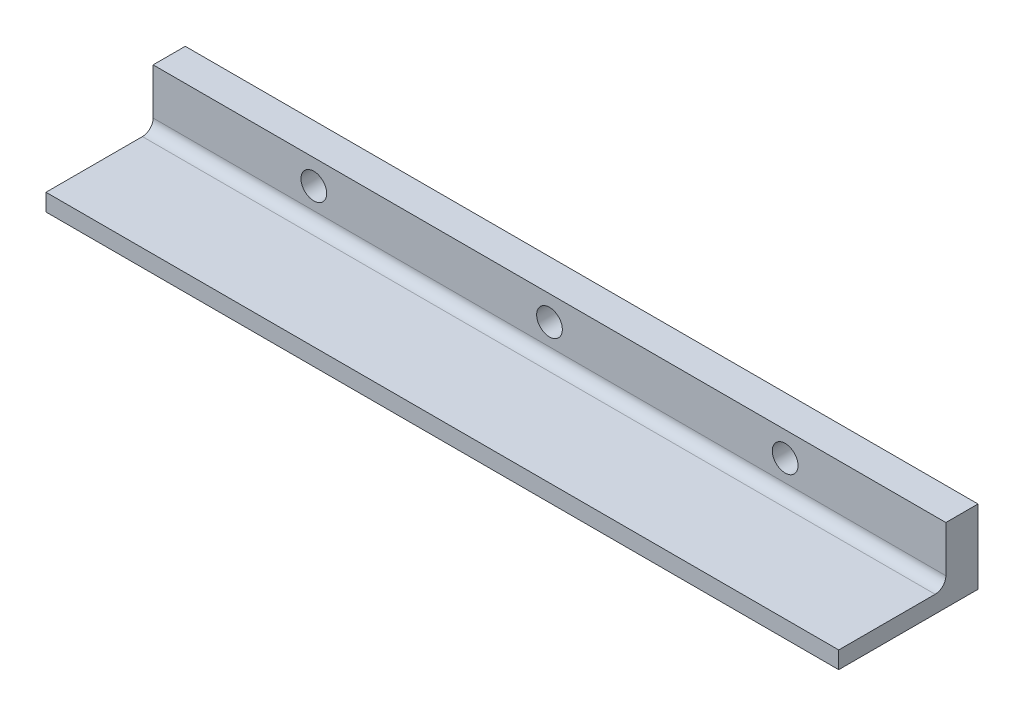
ISO-10303-21;
HEADER;
FILE_DESCRIPTION(('STEP AP214'),'2;1');
FILE_NAME('part.step','',(''),(''),'','','');
FILE_SCHEMA(('AUTOMOTIVE_DESIGN { 1 0 10303 214 1 1 1 1 }'));
ENDSEC;
DATA;
#1=APPLICATION_CONTEXT('core data for automotive mechanical design processes');
#2=APPLICATION_PROTOCOL_DEFINITION('international standard','automotive_design',2000,#1);
#3=PRODUCT_CONTEXT('',#1,'mechanical');
#4=PRODUCT('Part','Part','',(#3));
#5=PRODUCT_RELATED_PRODUCT_CATEGORY('part','',(#4));
#6=PRODUCT_DEFINITION_FORMATION('','',#4);
#7=PRODUCT_DEFINITION_CONTEXT('part definition',#1,'design');
#8=PRODUCT_DEFINITION('design','',#6,#7);
#9=PRODUCT_DEFINITION_SHAPE('','',#8);
#10=(LENGTH_UNIT() NAMED_UNIT(*) SI_UNIT(.MILLI.,.METRE.));
#11=(NAMED_UNIT(*) PLANE_ANGLE_UNIT() SI_UNIT($,.RADIAN.));
#12=(NAMED_UNIT(*) SI_UNIT($,.STERADIAN.) SOLID_ANGLE_UNIT());
#13=UNCERTAINTY_MEASURE_WITH_UNIT(LENGTH_MEASURE(1.E-05),#10,'distance_accuracy_value','');
#14=(GEOMETRIC_REPRESENTATION_CONTEXT(3) GLOBAL_UNCERTAINTY_ASSIGNED_CONTEXT((#13)) GLOBAL_UNIT_ASSIGNED_CONTEXT((#10,
#11,#12)) REPRESENTATION_CONTEXT('',''));
#15=CARTESIAN_POINT('',(0.,0.,0.));
#16=DIRECTION('',(0.,0.,1.));
#17=DIRECTION('',(1.,0.,0.));
#18=AXIS2_PLACEMENT_3D('',#15,#16,#17);
#19=CARTESIAN_POINT('',(0.,1.6,0.));
#20=DIRECTION('',(0.,-1.,0.));
#21=DIRECTION('',(0.,0.,-1.));
#22=AXIS2_PLACEMENT_3D('',#19,#20,#21);
#23=PLANE('',#22);
#24=DIRECTION('',(0.,0.,-1.));
#25=VECTOR('',#24,1.);
#26=CARTESIAN_POINT('',(37.,1.6,6.5));
#27=LINE('',#26,#25);
#28=CARTESIAN_POINT('',(37.,1.6,6.5));
#29=VERTEX_POINT('',#28);
#30=CARTESIAN_POINT('',(37.,1.6,-2.5));
#31=VERTEX_POINT('',#30);
#32=EDGE_CURVE('E129',#29,#31,#27,.T.);
#33=ORIENTED_EDGE('',*,*,#32,.T.);
#34=DIRECTION('',(1.,0.,0.));
#35=VECTOR('',#34,1.);
#36=CARTESIAN_POINT('',(-37.,1.6,-2.5));
#37=LINE('',#36,#35);
#38=CARTESIAN_POINT('',(-37.,1.6,-2.5));
#39=VERTEX_POINT('',#38);
#40=EDGE_CURVE('E59',#31,#39,#37,.F.);
#41=ORIENTED_EDGE('',*,*,#40,.T.);
#42=DIRECTION('',(0.,0.,1.));
#43=VECTOR('',#42,1.);
#44=CARTESIAN_POINT('',(-37.,1.6,6.5));
#45=LINE('',#44,#43);
#46=CARTESIAN_POINT('',(-37.,1.6,6.5));
#47=VERTEX_POINT('',#46);
#48=EDGE_CURVE('E131',#39,#47,#45,.T.);
#49=ORIENTED_EDGE('',*,*,#48,.T.);
#50=DIRECTION('',(1.,0.,0.));
#51=VECTOR('',#50,1.);
#52=CARTESIAN_POINT('',(-37.,1.6,6.5));
#53=LINE('',#52,#51);
#54=EDGE_CURVE('E134',#47,#29,#53,.T.);
#55=ORIENTED_EDGE('',*,*,#54,.T.);
#56=EDGE_LOOP('',(#33,#41,#49,#55));
#57=FACE_BOUND('',#56,.T.);
#58=ADVANCED_FACE('F37',(#57),#23,.F.);
#59=CARTESIAN_POINT('',(37.,1.6,6.5));
#60=DIRECTION('',(-1.,0.,0.));
#61=DIRECTION('',(0.,0.,1.));
#62=AXIS2_PLACEMENT_3D('',#59,#60,#61);
#63=PLANE('',#62);
#64=DIRECTION('',(0.,0.,-1.));
#65=VECTOR('',#64,1.);
#66=CARTESIAN_POINT('',(37.,0.,6.5));
#67=LINE('',#66,#65);
#68=CARTESIAN_POINT('',(37.,0.,6.5));
#69=VERTEX_POINT('',#68);
#70=CARTESIAN_POINT('',(37.,0.,-6.5));
#71=VERTEX_POINT('',#70);
#72=EDGE_CURVE('E121',#69,#71,#67,.T.);
#73=ORIENTED_EDGE('',*,*,#72,.T.);
#74=DIRECTION('',(0.,-1.,0.));
#75=VECTOR('',#74,1.);
#76=CARTESIAN_POINT('',(37.,1.6,-6.5));
#77=LINE('',#76,#75);
#78=CARTESIAN_POINT('',(37.,6.9,-6.5));
#79=VERTEX_POINT('',#78);
#80=EDGE_CURVE('E148',#79,#71,#77,.T.);
#81=ORIENTED_EDGE('',*,*,#80,.F.);
#82=DIRECTION('',(0.,0.,-1.));
#83=VECTOR('',#82,1.);
#84=CARTESIAN_POINT('',(37.,6.9,-6.5));
#85=LINE('',#84,#83);
#86=CARTESIAN_POINT('',(37.,6.9,-3.5));
#87=VERTEX_POINT('',#86);
#88=EDGE_CURVE('E107',#87,#79,#85,.T.);
#89=ORIENTED_EDGE('',*,*,#88,.F.);
#90=DIRECTION('',(0.,-1.,0.));
#91=VECTOR('',#90,1.);
#92=CARTESIAN_POINT('',(37.,6.9,-3.5));
#93=LINE('',#92,#91);
#94=CARTESIAN_POINT('',(37.,2.6,-3.5));
#95=VERTEX_POINT('',#94);
#96=EDGE_CURVE('E103',#87,#95,#93,.T.);
#97=ORIENTED_EDGE('',*,*,#96,.T.);
#98=CARTESIAN_POINT('',(37.,2.6,-2.5));
#99=DIRECTION('',(-1.,0.,0.));
#100=DIRECTION('',(0.,0.,1.));
#101=AXIS2_PLACEMENT_3D('',#98,#99,#100);
#102=CIRCLE('',#101,1.);
#103=EDGE_CURVE('E46',#95,#31,#102,.T.);
#104=ORIENTED_EDGE('',*,*,#103,.T.);
#105=ORIENTED_EDGE('',*,*,#32,.F.);
#106=DIRECTION('',(0.,-1.,0.));
#107=VECTOR('',#106,1.);
#108=CARTESIAN_POINT('',(37.,1.6,6.5));
#109=LINE('',#108,#107);
#110=EDGE_CURVE('E135',#29,#69,#109,.T.);
#111=ORIENTED_EDGE('',*,*,#110,.T.);
#112=EDGE_LOOP('',(#73,#81,#89,#97,#104,#105,#111));
#113=FACE_BOUND('',#112,.T.);
#114=ADVANCED_FACE('F155',(#113),#63,.F.);
#115=CARTESIAN_POINT('',(-37.,1.6,-6.5));
#116=DIRECTION('',(0.,0.,1.));
#117=DIRECTION('',(1.,0.,0.));
#118=AXIS2_PLACEMENT_3D('',#115,#116,#117);
#119=PLANE('',#118);
#120=CARTESIAN_POINT('',(-22.,4.6,-6.5));
#121=DIRECTION('',(0.,0.,-1.));
#122=DIRECTION('',(-1.,0.,0.));
#123=AXIS2_PLACEMENT_3D('',#120,#121,#122);
#124=CIRCLE('',#123,1.2);
#125=CARTESIAN_POINT('',(-23.2,4.6,-6.5));
#126=VERTEX_POINT('',#125);
#127=EDGE_CURVE('E169',#126,#126,#124,.T.);
#128=ORIENTED_EDGE('',*,*,#127,.F.);
#129=EDGE_LOOP('',(#128));
#130=FACE_BOUND('',#129,.T.);
#131=CARTESIAN_POINT('',(0.,4.6,-6.5));
#132=DIRECTION('',(0.,0.,-1.));
#133=DIRECTION('',(-1.,0.,0.));
#134=AXIS2_PLACEMENT_3D('',#131,#132,#133);
#135=CIRCLE('',#134,1.2);
#136=CARTESIAN_POINT('',(-1.2,4.6,-6.5));
#137=VERTEX_POINT('',#136);
#138=EDGE_CURVE('E163',#137,#137,#135,.T.);
#139=ORIENTED_EDGE('',*,*,#138,.F.);
#140=EDGE_LOOP('',(#139));
#141=FACE_BOUND('',#140,.T.);
#142=CARTESIAN_POINT('',(22.,4.60000000000001,-6.5));
#143=DIRECTION('',(0.,0.,-1.));
#144=DIRECTION('',(-1.,0.,0.));
#145=AXIS2_PLACEMENT_3D('',#142,#143,#144);
#146=CIRCLE('',#145,1.2);
#147=CARTESIAN_POINT('',(20.8,4.60000000000001,-6.5));
#148=VERTEX_POINT('',#147);
#149=EDGE_CURVE('E160',#148,#148,#146,.T.);
#150=ORIENTED_EDGE('',*,*,#149,.F.);
#151=EDGE_LOOP('',(#150));
#152=FACE_BOUND('',#151,.T.);
#153=DIRECTION('',(-1.,0.,0.));
#154=VECTOR('',#153,1.);
#155=CARTESIAN_POINT('',(-37.,0.,-6.5));
#156=LINE('',#155,#154);
#157=CARTESIAN_POINT('',(-37.,0.,-6.5));
#158=VERTEX_POINT('',#157);
#159=EDGE_CURVE('E124',#71,#158,#156,.T.);
#160=ORIENTED_EDGE('',*,*,#159,.T.);
#161=DIRECTION('',(0.,-1.,0.));
#162=VECTOR('',#161,1.);
#163=CARTESIAN_POINT('',(-37.,1.6,-6.5));
#164=LINE('',#163,#162);
#165=CARTESIAN_POINT('',(-37.,6.9,-6.5));
#166=VERTEX_POINT('',#165);
#167=EDGE_CURVE('E146',#166,#158,#164,.T.);
#168=ORIENTED_EDGE('',*,*,#167,.F.);
#169=DIRECTION('',(-1.,0.,0.));
#170=VECTOR('',#169,1.);
#171=CARTESIAN_POINT('',(-37.,6.9,-6.5));
#172=LINE('',#171,#170);
#173=EDGE_CURVE('E114',#79,#166,#172,.T.);
#174=ORIENTED_EDGE('',*,*,#173,.F.);
#175=ORIENTED_EDGE('',*,*,#80,.T.);
#176=EDGE_LOOP('',(#160,#168,#174,#175));
#177=FACE_BOUND('',#176,.T.);
#178=ADVANCED_FACE('F176',(#130,#141,#152,#177),#119,.F.);
#179=CARTESIAN_POINT('',(-37.,1.6,6.5));
#180=DIRECTION('',(1.,0.,0.));
#181=DIRECTION('',(0.,0.,-1.));
#182=AXIS2_PLACEMENT_3D('',#179,#180,#181);
#183=PLANE('',#182);
#184=DIRECTION('',(0.,0.,1.));
#185=VECTOR('',#184,1.);
#186=CARTESIAN_POINT('',(-37.,0.,6.5));
#187=LINE('',#186,#185);
#188=CARTESIAN_POINT('',(-37.,0.,6.5));
#189=VERTEX_POINT('',#188);
#190=EDGE_CURVE('E138',#158,#189,#187,.T.);
#191=ORIENTED_EDGE('',*,*,#190,.T.);
#192=DIRECTION('',(0.,-1.,0.));
#193=VECTOR('',#192,1.);
#194=CARTESIAN_POINT('',(-37.,1.6,6.5));
#195=LINE('',#194,#193);
#196=EDGE_CURVE('E143',#47,#189,#195,.T.);
#197=ORIENTED_EDGE('',*,*,#196,.F.);
#198=ORIENTED_EDGE('',*,*,#48,.F.);
#199=CARTESIAN_POINT('',(-37.,2.6,-2.5));
#200=DIRECTION('',(1.,0.,0.));
#201=DIRECTION('',(0.,0.,-1.));
#202=AXIS2_PLACEMENT_3D('',#199,#200,#201);
#203=CIRCLE('',#202,1.);
#204=CARTESIAN_POINT('',(-37.,2.6,-3.5));
#205=VERTEX_POINT('',#204);
#206=EDGE_CURVE('E11',#39,#205,#203,.T.);
#207=ORIENTED_EDGE('',*,*,#206,.T.);
#208=DIRECTION('',(0.,-1.,0.));
#209=VECTOR('',#208,1.);
#210=CARTESIAN_POINT('',(-37.,6.9,-3.5));
#211=LINE('',#210,#209);
#212=CARTESIAN_POINT('',(-37.,6.9,-3.5));
#213=VERTEX_POINT('',#212);
#214=EDGE_CURVE('E101',#213,#205,#211,.T.);
#215=ORIENTED_EDGE('',*,*,#214,.F.);
#216=DIRECTION('',(0.,0.,1.));
#217=VECTOR('',#216,1.);
#218=CARTESIAN_POINT('',(-37.,6.9,-6.5));
#219=LINE('',#218,#217);
#220=EDGE_CURVE('E108',#166,#213,#219,.T.);
#221=ORIENTED_EDGE('',*,*,#220,.F.);
#222=ORIENTED_EDGE('',*,*,#167,.T.);
#223=EDGE_LOOP('',(#191,#197,#198,#207,#215,#221,#222));
#224=FACE_BOUND('',#223,.T.);
#225=ADVANCED_FACE('F119',(#224),#183,.F.);
#226=CARTESIAN_POINT('',(-37.,1.6,6.5));
#227=DIRECTION('',(0.,0.,-1.));
#228=DIRECTION('',(-1.,0.,0.));
#229=AXIS2_PLACEMENT_3D('',#226,#227,#228);
#230=PLANE('',#229);
#231=DIRECTION('',(1.,0.,0.));
#232=VECTOR('',#231,1.);
#233=CARTESIAN_POINT('',(-37.,0.,6.5));
#234=LINE('',#233,#232);
#235=EDGE_CURVE('E132',#189,#69,#234,.T.);
#236=ORIENTED_EDGE('',*,*,#235,.T.);
#237=ORIENTED_EDGE('',*,*,#110,.F.);
#238=ORIENTED_EDGE('',*,*,#54,.F.);
#239=ORIENTED_EDGE('',*,*,#196,.T.);
#240=EDGE_LOOP('',(#236,#237,#238,#239));
#241=FACE_BOUND('',#240,.T.);
#242=ADVANCED_FACE('F192',(#241),#230,.F.);
#243=CARTESIAN_POINT('',(0.,0.,0.));
#244=DIRECTION('',(0.,-1.,0.));
#245=DIRECTION('',(0.,0.,-1.));
#246=AXIS2_PLACEMENT_3D('',#243,#244,#245);
#247=PLANE('',#246);
#248=ORIENTED_EDGE('',*,*,#72,.F.);
#249=ORIENTED_EDGE('',*,*,#235,.F.);
#250=ORIENTED_EDGE('',*,*,#190,.F.);
#251=ORIENTED_EDGE('',*,*,#159,.F.);
#252=EDGE_LOOP('',(#248,#249,#250,#251));
#253=FACE_BOUND('',#252,.T.);
#254=ADVANCED_FACE('F189',(#253),#247,.T.);
#255=CARTESIAN_POINT('',(-37.,6.9,-3.5));
#256=DIRECTION('',(0.,0.,-1.));
#257=DIRECTION('',(-1.,0.,0.));
#258=AXIS2_PLACEMENT_3D('',#255,#256,#257);
#259=PLANE('',#258);
#260=CARTESIAN_POINT('',(-22.,4.6,-3.5));
#261=DIRECTION('',(0.,0.,-1.));
#262=DIRECTION('',(-1.,0.,0.));
#263=AXIS2_PLACEMENT_3D('',#260,#261,#262);
#264=CIRCLE('',#263,1.2);
#265=CARTESIAN_POINT('',(-23.2,4.6,-3.5));
#266=VERTEX_POINT('',#265);
#267=EDGE_CURVE('E166',#266,#266,#264,.T.);
#268=ORIENTED_EDGE('',*,*,#267,.T.);
#269=EDGE_LOOP('',(#268));
#270=FACE_BOUND('',#269,.T.);
#271=CARTESIAN_POINT('',(0.,4.6,-3.5));
#272=DIRECTION('',(0.,0.,-1.));
#273=DIRECTION('',(-1.,0.,0.));
#274=AXIS2_PLACEMENT_3D('',#271,#272,#273);
#275=CIRCLE('',#274,1.2);
#276=CARTESIAN_POINT('',(-1.2,4.6,-3.5));
#277=VERTEX_POINT('',#276);
#278=EDGE_CURVE('E41',#277,#277,#275,.T.);
#279=ORIENTED_EDGE('',*,*,#278,.T.);
#280=EDGE_LOOP('',(#279));
#281=FACE_BOUND('',#280,.T.);
#282=CARTESIAN_POINT('',(22.,4.60000000000001,-3.5));
#283=DIRECTION('',(0.,0.,-1.));
#284=DIRECTION('',(-1.,0.,0.));
#285=AXIS2_PLACEMENT_3D('',#282,#283,#284);
#286=CIRCLE('',#285,1.2);
#287=CARTESIAN_POINT('',(20.8,4.60000000000001,-3.5));
#288=VERTEX_POINT('',#287);
#289=EDGE_CURVE('E117',#288,#288,#286,.T.);
#290=ORIENTED_EDGE('',*,*,#289,.T.);
#291=EDGE_LOOP('',(#290));
#292=FACE_BOUND('',#291,.T.);
#293=ORIENTED_EDGE('',*,*,#214,.T.);
#294=DIRECTION('',(1.,0.,0.));
#295=VECTOR('',#294,1.);
#296=CARTESIAN_POINT('',(37.,2.6,-3.5));
#297=LINE('',#296,#295);
#298=EDGE_CURVE('E151',#205,#95,#297,.T.);
#299=ORIENTED_EDGE('',*,*,#298,.T.);
#300=ORIENTED_EDGE('',*,*,#96,.F.);
#301=DIRECTION('',(1.,0.,0.));
#302=VECTOR('',#301,1.);
#303=CARTESIAN_POINT('',(-37.,6.9,-3.5));
#304=LINE('',#303,#302);
#305=EDGE_CURVE('E96',#213,#87,#304,.T.);
#306=ORIENTED_EDGE('',*,*,#305,.F.);
#307=EDGE_LOOP('',(#293,#299,#300,#306));
#308=FACE_BOUND('',#307,.T.);
#309=ADVANCED_FACE('F98',(#270,#281,#292,#308),#259,.F.);
#310=CARTESIAN_POINT('',(0.,6.9,0.));
#311=DIRECTION('',(0.,1.,0.));
#312=DIRECTION('',(0.,0.,1.));
#313=AXIS2_PLACEMENT_3D('',#310,#311,#312);
#314=PLANE('',#313);
#315=ORIENTED_EDGE('',*,*,#220,.T.);
#316=ORIENTED_EDGE('',*,*,#305,.T.);
#317=ORIENTED_EDGE('',*,*,#88,.T.);
#318=ORIENTED_EDGE('',*,*,#173,.T.);
#319=EDGE_LOOP('',(#315,#316,#317,#318));
#320=FACE_BOUND('',#319,.T.);
#321=ADVANCED_FACE('F112',(#320),#314,.T.);
#322=CARTESIAN_POINT('',(-37.,2.6,-2.5));
#323=DIRECTION('',(-1.,0.,0.));
#324=DIRECTION('',(0.,0.,1.));
#325=AXIS2_PLACEMENT_3D('',#322,#323,#324);
#326=CYLINDRICAL_SURFACE('',#325,1.);
#327=ORIENTED_EDGE('',*,*,#206,.F.);
#328=ORIENTED_EDGE('',*,*,#40,.F.);
#329=ORIENTED_EDGE('',*,*,#103,.F.);
#330=ORIENTED_EDGE('',*,*,#298,.F.);
#331=EDGE_LOOP('',(#327,#328,#329,#330));
#332=FACE_BOUND('',#331,.T.);
#333=ADVANCED_FACE('F39',(#332),#326,.F.);
#334=CARTESIAN_POINT('',(22.,4.60000000000001,-6.5));
#335=DIRECTION('',(0.,0.,-1.));
#336=DIRECTION('',(-1.,0.,0.));
#337=AXIS2_PLACEMENT_3D('',#334,#335,#336);
#338=CYLINDRICAL_SURFACE('',#337,1.2);
#339=ORIENTED_EDGE('',*,*,#149,.T.);
#340=EDGE_LOOP('',(#339));
#341=FACE_BOUND('',#340,.T.);
#342=ORIENTED_EDGE('',*,*,#289,.F.);
#343=EDGE_LOOP('',(#342));
#344=FACE_BOUND('',#343,.T.);
#345=ADVANCED_FACE('F195',(#341,#344),#338,.F.);
#346=CARTESIAN_POINT('',(0.,4.6,-6.5));
#347=DIRECTION('',(0.,0.,-1.));
#348=DIRECTION('',(-1.,0.,0.));
#349=AXIS2_PLACEMENT_3D('',#346,#347,#348);
#350=CYLINDRICAL_SURFACE('',#349,1.2);
#351=ORIENTED_EDGE('',*,*,#138,.T.);
#352=EDGE_LOOP('',(#351));
#353=FACE_BOUND('',#352,.T.);
#354=ORIENTED_EDGE('',*,*,#278,.F.);
#355=EDGE_LOOP('',(#354));
#356=FACE_BOUND('',#355,.T.);
#357=ADVANCED_FACE('F200',(#353,#356),#350,.F.);
#358=CARTESIAN_POINT('',(-22.,4.6,-6.5));
#359=DIRECTION('',(0.,0.,-1.));
#360=DIRECTION('',(-1.,0.,0.));
#361=AXIS2_PLACEMENT_3D('',#358,#359,#360);
#362=CYLINDRICAL_SURFACE('',#361,1.2);
#363=ORIENTED_EDGE('',*,*,#127,.T.);
#364=EDGE_LOOP('',(#363));
#365=FACE_BOUND('',#364,.T.);
#366=ORIENTED_EDGE('',*,*,#267,.F.);
#367=EDGE_LOOP('',(#366));
#368=FACE_BOUND('',#367,.T.);
#369=ADVANCED_FACE('F173',(#365,#368),#362,.F.);
#370=CLOSED_SHELL('',(#58,#114,#178,#225,#242,#254,#309,#321,#333,#345,#357,#369));
#371=MANIFOLD_SOLID_BREP('B2',#370);
#372=ADVANCED_BREP_SHAPE_REPRESENTATION('',(#18,#371),#14);
#373=SHAPE_DEFINITION_REPRESENTATION(#9,#372);
ENDSEC;
END-ISO-10303-21;
